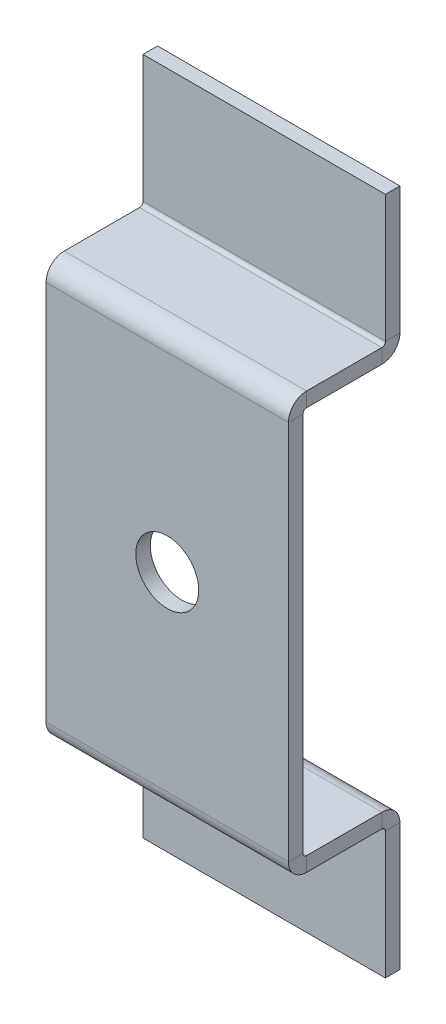
ISO-10303-21;
HEADER;
FILE_DESCRIPTION(('STEP AP214'),'2;1');
FILE_NAME('part.step','',(''),(''),'','','');
FILE_SCHEMA(('AUTOMOTIVE_DESIGN { 1 0 10303 214 1 1 1 1 }'));
ENDSEC;
DATA;
#1=APPLICATION_CONTEXT('core data for automotive mechanical design processes');
#2=APPLICATION_PROTOCOL_DEFINITION('international standard','automotive_design',2000,#1);
#3=PRODUCT_CONTEXT('',#1,'mechanical');
#4=PRODUCT('Part','Part','',(#3));
#5=PRODUCT_RELATED_PRODUCT_CATEGORY('part','',(#4));
#6=PRODUCT_DEFINITION_FORMATION('','',#4);
#7=PRODUCT_DEFINITION_CONTEXT('part definition',#1,'design');
#8=PRODUCT_DEFINITION('design','',#6,#7);
#9=PRODUCT_DEFINITION_SHAPE('','',#8);
#10=(LENGTH_UNIT() NAMED_UNIT(*) SI_UNIT(.MILLI.,.METRE.));
#11=(NAMED_UNIT(*) PLANE_ANGLE_UNIT() SI_UNIT($,.RADIAN.));
#12=(NAMED_UNIT(*) SI_UNIT($,.STERADIAN.) SOLID_ANGLE_UNIT());
#13=UNCERTAINTY_MEASURE_WITH_UNIT(LENGTH_MEASURE(1.E-05),#10,'distance_accuracy_value','');
#14=(GEOMETRIC_REPRESENTATION_CONTEXT(3) GLOBAL_UNCERTAINTY_ASSIGNED_CONTEXT((#13)) GLOBAL_UNIT_ASSIGNED_CONTEXT((#10,
#11,#12)) REPRESENTATION_CONTEXT('',''));
#15=CARTESIAN_POINT('',(0.,0.,0.));
#16=DIRECTION('',(0.,0.,1.));
#17=DIRECTION('',(1.,0.,0.));
#18=AXIS2_PLACEMENT_3D('',#15,#16,#17);
#19=CARTESIAN_POINT('',(0.,83.0000000000001,-20.));
#20=DIRECTION('',(-1.,0.,0.));
#21=DIRECTION('',(0.,0.,1.));
#22=AXIS2_PLACEMENT_3D('',#19,#20,#21);
#23=PLANE('',#22);
#24=DIRECTION('',(0.,0.,-1.));
#25=VECTOR('',#24,1.);
#26=CARTESIAN_POINT('',(0.,83.0000000000001,-20.));
#27=LINE('',#26,#25);
#28=CARTESIAN_POINT('',(0.,83.,-3.7366));
#29=VERTEX_POINT('',#28);
#30=CARTESIAN_POINT('',(0.,83.0000000000001,-19.2634));
#31=VERTEX_POINT('',#30);
#32=EDGE_CURVE('E351',#29,#31,#27,.T.);
#33=ORIENTED_EDGE('',*,*,#32,.T.);
#34=DIRECTION('',(0.,-1.,0.));
#35=VECTOR('',#34,1.);
#36=CARTESIAN_POINT('',(0.,83.0000000000001,-19.2634));
#37=LINE('',#36,#35);
#38=CARTESIAN_POINT('',(0.,80.0000000000001,-19.2634));
#39=VERTEX_POINT('',#38);
#40=EDGE_CURVE('E233',#31,#39,#37,.T.);
#41=ORIENTED_EDGE('',*,*,#40,.T.);
#42=DIRECTION('',(0.,0.,-1.));
#43=VECTOR('',#42,1.);
#44=CARTESIAN_POINT('',(0.,80.0000000000001,-20.));
#45=LINE('',#44,#43);
#46=CARTESIAN_POINT('',(0.,80.,-3.73660000000001));
#47=VERTEX_POINT('',#46);
#48=EDGE_CURVE('E350',#47,#39,#45,.T.);
#49=ORIENTED_EDGE('',*,*,#48,.F.);
#50=DIRECTION('',(0.,1.,0.));
#51=VECTOR('',#50,1.);
#52=CARTESIAN_POINT('',(0.,80.,-3.73660000000001));
#53=LINE('',#52,#51);
#54=EDGE_CURVE('E336',#47,#29,#53,.T.);
#55=ORIENTED_EDGE('',*,*,#54,.T.);
#56=EDGE_LOOP('',(#33,#41,#49,#55));
#57=FACE_BOUND('',#56,.T.);
#58=ADVANCED_FACE('F39',(#57),#23,.T.);
#59=CARTESIAN_POINT('',(0.,83.,2.71703390987154E-13));
#60=DIRECTION('',(0.,1.,0.));
#61=DIRECTION('',(0.,0.,1.));
#62=AXIS2_PLACEMENT_3D('',#59,#60,#61);
#63=PLANE('',#62);
#64=DIRECTION('',(0.,0.,1.));
#65=VECTOR('',#64,1.);
#66=CARTESIAN_POINT('',(50.,83.,-2.99999999999999));
#67=LINE('',#66,#65);
#68=CARTESIAN_POINT('',(50.,83.0000000000001,-19.2634));
#69=VERTEX_POINT('',#68);
#70=CARTESIAN_POINT('',(50.,83.,-3.7366));
#71=VERTEX_POINT('',#70);
#72=EDGE_CURVE('E353',#69,#71,#67,.T.);
#73=ORIENTED_EDGE('',*,*,#72,.F.);
#74=DIRECTION('',(-1.,0.,0.));
#75=VECTOR('',#74,1.);
#76=CARTESIAN_POINT('',(0.,83.0000000000001,-19.2634));
#77=LINE('',#76,#75);
#78=EDGE_CURVE('E63',#31,#69,#77,.F.);
#79=ORIENTED_EDGE('',*,*,#78,.F.);
#80=ORIENTED_EDGE('',*,*,#32,.F.);
#81=DIRECTION('',(1.,0.,0.));
#82=VECTOR('',#81,1.);
#83=CARTESIAN_POINT('',(0.,83.,-3.7366));
#84=LINE('',#83,#82);
#85=EDGE_CURVE('E345',#29,#71,#84,.T.);
#86=ORIENTED_EDGE('',*,*,#85,.T.);
#87=EDGE_LOOP('',(#73,#79,#80,#86));
#88=FACE_BOUND('',#87,.T.);
#89=ADVANCED_FACE('F400',(#88),#63,.T.);
#90=CARTESIAN_POINT('',(0.,80.,2.61228946970625E-13));
#91=DIRECTION('',(0.,1.,0.));
#92=DIRECTION('',(0.,0.,1.));
#93=AXIS2_PLACEMENT_3D('',#90,#91,#92);
#94=PLANE('',#93);
#95=DIRECTION('',(-1.,0.,0.));
#96=VECTOR('',#95,1.);
#97=CARTESIAN_POINT('',(0.,80.0000000000001,-19.2634));
#98=LINE('',#97,#96);
#99=CARTESIAN_POINT('',(50.,80.0000000000001,-19.2634));
#100=VERTEX_POINT('',#99);
#101=EDGE_CURVE('E186',#39,#100,#98,.F.);
#102=ORIENTED_EDGE('',*,*,#101,.T.);
#103=DIRECTION('',(0.,0.,1.));
#104=VECTOR('',#103,1.);
#105=CARTESIAN_POINT('',(50.,80.,-3.));
#106=LINE('',#105,#104);
#107=CARTESIAN_POINT('',(50.,80.,-3.73660000000001));
#108=VERTEX_POINT('',#107);
#109=EDGE_CURVE('E354',#100,#108,#106,.T.);
#110=ORIENTED_EDGE('',*,*,#109,.T.);
#111=DIRECTION('',(1.,0.,0.));
#112=VECTOR('',#111,1.);
#113=CARTESIAN_POINT('',(0.,80.,-3.73660000000001));
#114=LINE('',#113,#112);
#115=EDGE_CURVE('E339',#47,#108,#114,.T.);
#116=ORIENTED_EDGE('',*,*,#115,.F.);
#117=ORIENTED_EDGE('',*,*,#48,.T.);
#118=EDGE_LOOP('',(#102,#110,#116,#117));
#119=FACE_BOUND('',#118,.T.);
#120=ADVANCED_FACE('F408',(#119),#94,.F.);
#121=CARTESIAN_POINT('',(50.,-3.,-2.99999999999999));
#122=DIRECTION('',(1.,0.,0.));
#123=DIRECTION('',(0.,0.,-1.));
#124=AXIS2_PLACEMENT_3D('',#121,#122,#123);
#125=PLANE('',#124);
#126=DIRECTION('',(0.,0.,-1.));
#127=VECTOR('',#126,1.);
#128=CARTESIAN_POINT('',(50.,-3.,-2.99999999999999));
#129=LINE('',#128,#127);
#130=CARTESIAN_POINT('',(50.,-3.,-3.73659999999999));
#131=VERTEX_POINT('',#130);
#132=CARTESIAN_POINT('',(50.,-3.00000000000006,-19.2634));
#133=VERTEX_POINT('',#132);
#134=EDGE_CURVE('E306',#131,#133,#129,.T.);
#135=ORIENTED_EDGE('',*,*,#134,.T.);
#136=DIRECTION('',(0.,1.,0.));
#137=VECTOR('',#136,1.);
#138=CARTESIAN_POINT('',(50.,-3.00000000000006,-19.2634));
#139=LINE('',#138,#137);
#140=CARTESIAN_POINT('',(50.,0.,-19.2634));
#141=VERTEX_POINT('',#140);
#142=EDGE_CURVE('E279',#133,#141,#139,.T.);
#143=ORIENTED_EDGE('',*,*,#142,.T.);
#144=DIRECTION('',(0.,0.,-1.));
#145=VECTOR('',#144,1.);
#146=CARTESIAN_POINT('',(50.,0.,-3.));
#147=LINE('',#146,#145);
#148=CARTESIAN_POINT('',(50.,0.,-3.7366));
#149=VERTEX_POINT('',#148);
#150=EDGE_CURVE('E305',#149,#141,#147,.T.);
#151=ORIENTED_EDGE('',*,*,#150,.F.);
#152=DIRECTION('',(0.,-1.,0.));
#153=VECTOR('',#152,1.);
#154=CARTESIAN_POINT('',(50.,0.,-3.7366));
#155=LINE('',#154,#153);
#156=EDGE_CURVE('E292',#149,#131,#155,.T.);
#157=ORIENTED_EDGE('',*,*,#156,.T.);
#158=EDGE_LOOP('',(#135,#143,#151,#157));
#159=FACE_BOUND('',#158,.T.);
#160=ADVANCED_FACE('F432',(#159),#125,.T.);
#161=CARTESIAN_POINT('',(0.,-2.99999999999999,0.));
#162=DIRECTION('',(0.,1.,0.));
#163=DIRECTION('',(0.,0.,1.));
#164=AXIS2_PLACEMENT_3D('',#161,#162,#163);
#165=PLANE('',#164);
#166=DIRECTION('',(1.,0.,0.));
#167=VECTOR('',#166,1.);
#168=CARTESIAN_POINT('',(50.,-3.00000000000006,-19.2634));
#169=LINE('',#168,#167);
#170=CARTESIAN_POINT('',(0.,-3.00000000000006,-19.2634));
#171=VERTEX_POINT('',#170);
#172=EDGE_CURVE('E285',#133,#171,#169,.F.);
#173=ORIENTED_EDGE('',*,*,#172,.F.);
#174=ORIENTED_EDGE('',*,*,#134,.F.);
#175=DIRECTION('',(1.,0.,0.));
#176=VECTOR('',#175,1.);
#177=CARTESIAN_POINT('',(0.,-3.,-3.73659999999999));
#178=LINE('',#177,#176);
#179=CARTESIAN_POINT('',(0.,-3.,-3.73659999999999));
#180=VERTEX_POINT('',#179);
#181=EDGE_CURVE('E301',#180,#131,#178,.T.);
#182=ORIENTED_EDGE('',*,*,#181,.F.);
#183=DIRECTION('',(0.,0.,1.));
#184=VECTOR('',#183,1.);
#185=CARTESIAN_POINT('',(0.,-3.00000000000006,-20.));
#186=LINE('',#185,#184);
#187=EDGE_CURVE('E309',#171,#180,#186,.T.);
#188=ORIENTED_EDGE('',*,*,#187,.F.);
#189=EDGE_LOOP('',(#173,#174,#182,#188));
#190=FACE_BOUND('',#189,.T.);
#191=ADVANCED_FACE('F445',(#190),#165,.F.);
#192=CARTESIAN_POINT('',(0.,0.,0.));
#193=DIRECTION('',(0.,1.,0.));
#194=DIRECTION('',(0.,0.,1.));
#195=AXIS2_PLACEMENT_3D('',#192,#193,#194);
#196=PLANE('',#195);
#197=ORIENTED_EDGE('',*,*,#150,.T.);
#198=DIRECTION('',(1.,0.,0.));
#199=VECTOR('',#198,1.);
#200=CARTESIAN_POINT('',(50.,0.,-19.2634));
#201=LINE('',#200,#199);
#202=CARTESIAN_POINT('',(0.,0.,-19.2634));
#203=VERTEX_POINT('',#202);
#204=EDGE_CURVE('E272',#141,#203,#201,.F.);
#205=ORIENTED_EDGE('',*,*,#204,.T.);
#206=DIRECTION('',(0.,0.,1.));
#207=VECTOR('',#206,1.);
#208=CARTESIAN_POINT('',(0.,0.,-20.));
#209=LINE('',#208,#207);
#210=CARTESIAN_POINT('',(0.,0.,-3.7366));
#211=VERTEX_POINT('',#210);
#212=EDGE_CURVE('E310',#203,#211,#209,.T.);
#213=ORIENTED_EDGE('',*,*,#212,.T.);
#214=DIRECTION('',(-1.,0.,0.));
#215=VECTOR('',#214,1.);
#216=CARTESIAN_POINT('',(50.,0.,-3.7366));
#217=LINE('',#216,#215);
#218=EDGE_CURVE('E295',#149,#211,#217,.T.);
#219=ORIENTED_EDGE('',*,*,#218,.F.);
#220=EDGE_LOOP('',(#197,#205,#213,#219));
#221=FACE_BOUND('',#220,.T.);
#222=ADVANCED_FACE('F429',(#221),#196,.T.);
#223=CARTESIAN_POINT('',(0.,0.,-3.));
#224=DIRECTION('',(0.,0.,-1.));
#225=DIRECTION('',(-1.,0.,0.));
#226=AXIS2_PLACEMENT_3D('',#223,#224,#225);
#227=PLANE('',#226);
#228=CARTESIAN_POINT('',(25.,39.9999999999999,-3.));
#229=DIRECTION('',(0.,0.,-1.));
#230=DIRECTION('',(-1.,0.,0.));
#231=AXIS2_PLACEMENT_3D('',#228,#229,#230);
#232=CIRCLE('',#231,6.5);
#233=CARTESIAN_POINT('',(18.5,39.9999999999999,-3.));
#234=VERTEX_POINT('',#233);
#235=EDGE_CURVE('E489',#234,#234,#232,.T.);
#236=ORIENTED_EDGE('',*,*,#235,.F.);
#237=EDGE_LOOP('',(#236));
#238=FACE_BOUND('',#237,.T.);
#239=DIRECTION('',(0.,1.,0.));
#240=VECTOR('',#239,1.);
#241=CARTESIAN_POINT('',(50.,0.,-3.));
#242=LINE('',#241,#240);
#243=CARTESIAN_POINT('',(50.,0.736600000000001,-3.));
#244=VERTEX_POINT('',#243);
#245=CARTESIAN_POINT('',(50.,79.2634,-3.));
#246=VERTEX_POINT('',#245);
#247=EDGE_CURVE('E11',#244,#246,#242,.T.);
#248=ORIENTED_EDGE('',*,*,#247,.F.);
#249=DIRECTION('',(-1.,0.,0.));
#250=VECTOR('',#249,1.);
#251=CARTESIAN_POINT('',(0.,0.736599999999997,-3.));
#252=LINE('',#251,#250);
#253=CARTESIAN_POINT('',(0.,0.736599999999997,-3.));
#254=VERTEX_POINT('',#253);
#255=EDGE_CURVE('E328',#254,#244,#252,.F.);
#256=ORIENTED_EDGE('',*,*,#255,.F.);
#257=DIRECTION('',(0.,-1.,0.));
#258=VECTOR('',#257,1.);
#259=CARTESIAN_POINT('',(0.,0.,-3.));
#260=LINE('',#259,#258);
#261=CARTESIAN_POINT('',(0.,79.2634,-3.));
#262=VERTEX_POINT('',#261);
#263=EDGE_CURVE('E48',#262,#254,#260,.T.);
#264=ORIENTED_EDGE('',*,*,#263,.F.);
#265=DIRECTION('',(1.,0.,0.));
#266=VECTOR('',#265,1.);
#267=CARTESIAN_POINT('',(50.,79.2634,-3.));
#268=LINE('',#267,#266);
#269=EDGE_CURVE('E372',#246,#262,#268,.F.);
#270=ORIENTED_EDGE('',*,*,#269,.F.);
#271=EDGE_LOOP('',(#248,#256,#264,#270));
#272=FACE_BOUND('',#271,.T.);
#273=ADVANCED_FACE('F415',(#238,#272),#227,.T.);
#274=CARTESIAN_POINT('',(0.,0.,0.));
#275=DIRECTION('',(0.,0.,-1.));
#276=DIRECTION('',(-1.,0.,0.));
#277=AXIS2_PLACEMENT_3D('',#274,#275,#276);
#278=PLANE('',#277);
#279=CARTESIAN_POINT('',(25.,39.9999999999999,0.));
#280=DIRECTION('',(0.,0.,1.));
#281=DIRECTION('',(1.,0.,0.));
#282=AXIS2_PLACEMENT_3D('',#279,#280,#281);
#283=CIRCLE('',#282,6.5);
#284=CARTESIAN_POINT('',(31.5,39.9999999999999,0.));
#285=VERTEX_POINT('',#284);
#286=EDGE_CURVE('E487',#285,#285,#283,.T.);
#287=ORIENTED_EDGE('',*,*,#286,.F.);
#288=EDGE_LOOP('',(#287));
#289=FACE_BOUND('',#288,.T.);
#290=DIRECTION('',(-1.,0.,0.));
#291=VECTOR('',#290,1.);
#292=CARTESIAN_POINT('',(0.,0.736600000000005,0.));
#293=LINE('',#292,#291);
#294=CARTESIAN_POINT('',(0.,0.736600000000005,0.));
#295=VERTEX_POINT('',#294);
#296=CARTESIAN_POINT('',(50.,0.736600000000001,0.));
#297=VERTEX_POINT('',#296);
#298=EDGE_CURVE('E316',#295,#297,#293,.F.);
#299=ORIENTED_EDGE('',*,*,#298,.T.);
#300=DIRECTION('',(0.,1.,0.));
#301=VECTOR('',#300,1.);
#302=CARTESIAN_POINT('',(50.,0.,0.));
#303=LINE('',#302,#301);
#304=CARTESIAN_POINT('',(50.,79.2634,0.));
#305=VERTEX_POINT('',#304);
#306=EDGE_CURVE('E43',#297,#305,#303,.T.);
#307=ORIENTED_EDGE('',*,*,#306,.T.);
#308=DIRECTION('',(1.,0.,0.));
#309=VECTOR('',#308,1.);
#310=CARTESIAN_POINT('',(50.,79.2634,0.));
#311=LINE('',#310,#309);
#312=CARTESIAN_POINT('',(0.,79.2634,0.));
#313=VERTEX_POINT('',#312);
#314=EDGE_CURVE('E360',#305,#313,#311,.F.);
#315=ORIENTED_EDGE('',*,*,#314,.T.);
#316=DIRECTION('',(0.,-1.,0.));
#317=VECTOR('',#316,1.);
#318=CARTESIAN_POINT('',(0.,0.,0.));
#319=LINE('',#318,#317);
#320=EDGE_CURVE('E380',#313,#295,#319,.T.);
#321=ORIENTED_EDGE('',*,*,#320,.T.);
#322=EDGE_LOOP('',(#299,#307,#315,#321));
#323=FACE_BOUND('',#322,.T.);
#324=ADVANCED_FACE('F388',(#289,#323),#278,.F.);
#325=CARTESIAN_POINT('',(0.,0.,-3.));
#326=DIRECTION('',(-1.,0.,0.));
#327=DIRECTION('',(0.,-1.,0.));
#328=AXIS2_PLACEMENT_3D('',#325,#326,#327);
#329=PLANE('',#328);
#330=ORIENTED_EDGE('',*,*,#263,.T.);
#331=DIRECTION('',(0.,0.,1.));
#332=VECTOR('',#331,1.);
#333=CARTESIAN_POINT('',(0.,0.736599999999997,-3.));
#334=LINE('',#333,#332);
#335=EDGE_CURVE('E322',#254,#295,#334,.T.);
#336=ORIENTED_EDGE('',*,*,#335,.T.);
#337=ORIENTED_EDGE('',*,*,#320,.F.);
#338=DIRECTION('',(0.,0.,1.));
#339=VECTOR('',#338,1.);
#340=CARTESIAN_POINT('',(0.,79.2634,-3.));
#341=LINE('',#340,#339);
#342=EDGE_CURVE('E377',#262,#313,#341,.T.);
#343=ORIENTED_EDGE('',*,*,#342,.F.);
#344=EDGE_LOOP('',(#330,#336,#337,#343));
#345=FACE_BOUND('',#344,.T.);
#346=ADVANCED_FACE('F41',(#345),#329,.T.);
#347=CARTESIAN_POINT('',(50.,0.,-3.));
#348=DIRECTION('',(1.,0.,0.));
#349=DIRECTION('',(0.,1.,0.));
#350=AXIS2_PLACEMENT_3D('',#347,#348,#349);
#351=PLANE('',#350);
#352=DIRECTION('',(0.,0.,1.));
#353=VECTOR('',#352,1.);
#354=CARTESIAN_POINT('',(50.,0.736600000000001,-3.));
#355=LINE('',#354,#353);
#356=EDGE_CURVE('E333',#244,#297,#355,.T.);
#357=ORIENTED_EDGE('',*,*,#356,.F.);
#358=ORIENTED_EDGE('',*,*,#247,.T.);
#359=DIRECTION('',(0.,0.,1.));
#360=VECTOR('',#359,1.);
#361=CARTESIAN_POINT('',(50.,79.2634,-3.));
#362=LINE('',#361,#360);
#363=EDGE_CURVE('E366',#246,#305,#362,.T.);
#364=ORIENTED_EDGE('',*,*,#363,.T.);
#365=ORIENTED_EDGE('',*,*,#306,.F.);
#366=EDGE_LOOP('',(#357,#358,#364,#365));
#367=FACE_BOUND('',#366,.T.);
#368=ADVANCED_FACE('F455',(#367),#351,.T.);
#369=CARTESIAN_POINT('',(0.,79.2634,-3.73660000000001));
#370=DIRECTION('',(-1.,0.,0.));
#371=DIRECTION('',(0.,0.,1.));
#372=AXIS2_PLACEMENT_3D('',#369,#370,#371);
#373=PLANE('',#372);
#374=ORIENTED_EDGE('',*,*,#54,.F.);
#375=CARTESIAN_POINT('',(0.,79.2634,-3.73660000000001));
#376=DIRECTION('',(1.,0.,0.));
#377=DIRECTION('',(0.,0.,-1.));
#378=AXIS2_PLACEMENT_3D('',#375,#376,#377);
#379=CIRCLE('',#378,0.736600000000004);
#380=EDGE_CURVE('E369',#262,#47,#379,.F.);
#381=ORIENTED_EDGE('',*,*,#380,.F.);
#382=ORIENTED_EDGE('',*,*,#342,.T.);
#383=CARTESIAN_POINT('',(0.,79.2634,-3.73660000000001));
#384=DIRECTION('',(1.,0.,0.));
#385=DIRECTION('',(0.,0.,-1.));
#386=AXIS2_PLACEMENT_3D('',#383,#384,#385);
#387=CIRCLE('',#386,3.7366);
#388=EDGE_CURVE('E362',#313,#29,#387,.F.);
#389=ORIENTED_EDGE('',*,*,#388,.T.);
#390=EDGE_LOOP('',(#374,#381,#382,#389));
#391=FACE_BOUND('',#390,.T.);
#392=ADVANCED_FACE('F402',(#391),#373,.T.);
#393=CARTESIAN_POINT('',(50.,79.2634,-3.73660000000001));
#394=DIRECTION('',(-1.,0.,0.));
#395=DIRECTION('',(0.,0.,1.));
#396=AXIS2_PLACEMENT_3D('',#393,#394,#395);
#397=PLANE('',#396);
#398=CARTESIAN_POINT('',(50.,79.2634,-3.73660000000001));
#399=DIRECTION('',(1.,0.,0.));
#400=DIRECTION('',(0.,0.,-1.));
#401=AXIS2_PLACEMENT_3D('',#398,#399,#400);
#402=CIRCLE('',#401,0.736600000000004);
#403=EDGE_CURVE('E356',#108,#246,#402,.T.);
#404=ORIENTED_EDGE('',*,*,#403,.F.);
#405=DIRECTION('',(0.,1.,0.));
#406=VECTOR('',#405,1.);
#407=CARTESIAN_POINT('',(50.,80.,-3.73660000000001));
#408=LINE('',#407,#406);
#409=EDGE_CURVE('E342',#108,#71,#408,.T.);
#410=ORIENTED_EDGE('',*,*,#409,.T.);
#411=CARTESIAN_POINT('',(50.,79.2634,-3.73660000000001));
#412=DIRECTION('',(1.,0.,0.));
#413=DIRECTION('',(0.,0.,-1.));
#414=AXIS2_PLACEMENT_3D('',#411,#412,#413);
#415=CIRCLE('',#414,3.7366);
#416=EDGE_CURVE('E363',#71,#305,#415,.T.);
#417=ORIENTED_EDGE('',*,*,#416,.T.);
#418=ORIENTED_EDGE('',*,*,#363,.F.);
#419=EDGE_LOOP('',(#404,#410,#417,#418));
#420=FACE_BOUND('',#419,.T.);
#421=ADVANCED_FACE('F398',(#420),#397,.F.);
#422=CARTESIAN_POINT('',(50.,79.2634,-3.73660000000001));
#423=DIRECTION('',(1.,0.,0.));
#424=DIRECTION('',(0.,1.,0.));
#425=AXIS2_PLACEMENT_3D('',#422,#423,#424);
#426=CYLINDRICAL_SURFACE('',#425,3.7366);
#427=ORIENTED_EDGE('',*,*,#314,.F.);
#428=ORIENTED_EDGE('',*,*,#416,.F.);
#429=ORIENTED_EDGE('',*,*,#85,.F.);
#430=ORIENTED_EDGE('',*,*,#388,.F.);
#431=EDGE_LOOP('',(#427,#428,#429,#430));
#432=FACE_BOUND('',#431,.T.);
#433=ADVANCED_FACE('F394',(#432),#426,.T.);
#434=CARTESIAN_POINT('',(50.,79.2634,-3.73660000000001));
#435=DIRECTION('',(1.,0.,0.));
#436=DIRECTION('',(0.,1.,0.));
#437=AXIS2_PLACEMENT_3D('',#434,#435,#436);
#438=CYLINDRICAL_SURFACE('',#437,0.736600000000004);
#439=ORIENTED_EDGE('',*,*,#269,.T.);
#440=ORIENTED_EDGE('',*,*,#380,.T.);
#441=ORIENTED_EDGE('',*,*,#115,.T.);
#442=ORIENTED_EDGE('',*,*,#403,.T.);
#443=EDGE_LOOP('',(#439,#440,#441,#442));
#444=FACE_BOUND('',#443,.T.);
#445=ADVANCED_FACE('F410',(#444),#438,.F.);
#446=CARTESIAN_POINT('',(50.,83.,-2.99999999999999));
#447=DIRECTION('',(1.,0.,0.));
#448=DIRECTION('',(0.,0.,-1.));
#449=AXIS2_PLACEMENT_3D('',#446,#447,#448);
#450=PLANE('',#449);
#451=DIRECTION('',(0.,-1.,0.));
#452=VECTOR('',#451,1.);
#453=CARTESIAN_POINT('',(50.,83.0000000000001,-19.2634));
#454=LINE('',#453,#452);
#455=EDGE_CURVE('E56',#69,#100,#454,.T.);
#456=ORIENTED_EDGE('',*,*,#455,.F.);
#457=ORIENTED_EDGE('',*,*,#72,.T.);
#458=ORIENTED_EDGE('',*,*,#409,.F.);
#459=ORIENTED_EDGE('',*,*,#109,.F.);
#460=EDGE_LOOP('',(#456,#457,#458,#459));
#461=FACE_BOUND('',#460,.T.);
#462=ADVANCED_FACE('F471',(#461),#450,.T.);
#463=CARTESIAN_POINT('',(50.,0.736599999999999,-3.7366));
#464=DIRECTION('',(1.,0.,0.));
#465=DIRECTION('',(0.,1.,0.));
#466=AXIS2_PLACEMENT_3D('',#463,#464,#465);
#467=PLANE('',#466);
#468=ORIENTED_EDGE('',*,*,#156,.F.);
#469=CARTESIAN_POINT('',(50.,0.736599999999999,-3.7366));
#470=DIRECTION('',(-1.,0.,0.));
#471=DIRECTION('',(0.,-1.,0.));
#472=AXIS2_PLACEMENT_3D('',#469,#470,#471);
#473=CIRCLE('',#472,0.736600000000002);
#474=EDGE_CURVE('E325',#244,#149,#473,.F.);
#475=ORIENTED_EDGE('',*,*,#474,.F.);
#476=ORIENTED_EDGE('',*,*,#356,.T.);
#477=CARTESIAN_POINT('',(50.,0.736599999999999,-3.7366));
#478=DIRECTION('',(-1.,0.,0.));
#479=DIRECTION('',(0.,-1.,0.));
#480=AXIS2_PLACEMENT_3D('',#477,#478,#479);
#481=CIRCLE('',#480,3.7366);
#482=EDGE_CURVE('E318',#297,#131,#481,.F.);
#483=ORIENTED_EDGE('',*,*,#482,.T.);
#484=EDGE_LOOP('',(#468,#475,#476,#483));
#485=FACE_BOUND('',#484,.T.);
#486=ADVANCED_FACE('F454',(#485),#467,.T.);
#487=CARTESIAN_POINT('',(0.,0.736599999999996,-3.7366));
#488=DIRECTION('',(1.,0.,0.));
#489=DIRECTION('',(0.,1.,0.));
#490=AXIS2_PLACEMENT_3D('',#487,#488,#489);
#491=PLANE('',#490);
#492=CARTESIAN_POINT('',(0.,0.736599999999996,-3.7366));
#493=DIRECTION('',(-1.,0.,0.));
#494=DIRECTION('',(0.,-1.,0.));
#495=AXIS2_PLACEMENT_3D('',#492,#493,#494);
#496=CIRCLE('',#495,0.736600000000002);
#497=EDGE_CURVE('E312',#211,#254,#496,.T.);
#498=ORIENTED_EDGE('',*,*,#497,.F.);
#499=DIRECTION('',(0.,-1.,0.));
#500=VECTOR('',#499,1.);
#501=CARTESIAN_POINT('',(0.,0.,-3.7366));
#502=LINE('',#501,#500);
#503=EDGE_CURVE('E298',#211,#180,#502,.T.);
#504=ORIENTED_EDGE('',*,*,#503,.T.);
#505=CARTESIAN_POINT('',(0.,0.736599999999996,-3.7366));
#506=DIRECTION('',(-1.,0.,0.));
#507=DIRECTION('',(0.,-1.,0.));
#508=AXIS2_PLACEMENT_3D('',#505,#506,#507);
#509=CIRCLE('',#508,3.7366);
#510=EDGE_CURVE('E319',#180,#295,#509,.T.);
#511=ORIENTED_EDGE('',*,*,#510,.T.);
#512=ORIENTED_EDGE('',*,*,#335,.F.);
#513=EDGE_LOOP('',(#498,#504,#511,#512));
#514=FACE_BOUND('',#513,.T.);
#515=ADVANCED_FACE('F420',(#514),#491,.F.);
#516=CARTESIAN_POINT('',(0.,0.736599999999996,-3.7366));
#517=DIRECTION('',(-1.,0.,0.));
#518=DIRECTION('',(0.,-1.,0.));
#519=AXIS2_PLACEMENT_3D('',#516,#517,#518);
#520=CYLINDRICAL_SURFACE('',#519,3.7366);
#521=ORIENTED_EDGE('',*,*,#298,.F.);
#522=ORIENTED_EDGE('',*,*,#510,.F.);
#523=ORIENTED_EDGE('',*,*,#181,.T.);
#524=ORIENTED_EDGE('',*,*,#482,.F.);
#525=EDGE_LOOP('',(#521,#522,#523,#524));
#526=FACE_BOUND('',#525,.T.);
#527=ADVANCED_FACE('F451',(#526),#520,.T.);
#528=CARTESIAN_POINT('',(0.,0.736599999999996,-3.7366));
#529=DIRECTION('',(-1.,0.,0.));
#530=DIRECTION('',(0.,-1.,0.));
#531=AXIS2_PLACEMENT_3D('',#528,#529,#530);
#532=CYLINDRICAL_SURFACE('',#531,0.736600000000002);
#533=ORIENTED_EDGE('',*,*,#255,.T.);
#534=ORIENTED_EDGE('',*,*,#474,.T.);
#535=ORIENTED_EDGE('',*,*,#218,.T.);
#536=ORIENTED_EDGE('',*,*,#497,.T.);
#537=EDGE_LOOP('',(#533,#534,#535,#536));
#538=FACE_BOUND('',#537,.T.);
#539=ADVANCED_FACE('F424',(#538),#532,.F.);
#540=CARTESIAN_POINT('',(0.,-3.00000000000006,-20.));
#541=DIRECTION('',(-1.,0.,0.));
#542=DIRECTION('',(0.,0.,1.));
#543=AXIS2_PLACEMENT_3D('',#540,#541,#542);
#544=PLANE('',#543);
#545=DIRECTION('',(0.,1.,0.));
#546=VECTOR('',#545,1.);
#547=CARTESIAN_POINT('',(0.,-3.00000000000006,-19.2634));
#548=LINE('',#547,#546);
#549=EDGE_CURVE('E289',#171,#203,#548,.T.);
#550=ORIENTED_EDGE('',*,*,#549,.F.);
#551=ORIENTED_EDGE('',*,*,#187,.T.);
#552=ORIENTED_EDGE('',*,*,#503,.F.);
#553=ORIENTED_EDGE('',*,*,#212,.F.);
#554=EDGE_LOOP('',(#550,#551,#552,#553));
#555=FACE_BOUND('',#554,.T.);
#556=ADVANCED_FACE('F449',(#555),#544,.T.);
#557=CARTESIAN_POINT('',(0.,-3.73660000000006,-19.2634));
#558=DIRECTION('',(-1.,0.,0.));
#559=DIRECTION('',(0.,0.,1.));
#560=AXIS2_PLACEMENT_3D('',#557,#558,#559);
#561=PLANE('',#560);
#562=DIRECTION('',(0.,0.,-1.));
#563=VECTOR('',#562,1.);
#564=CARTESIAN_POINT('',(0.,-3.73660000000006,-20.));
#565=LINE('',#564,#563);
#566=CARTESIAN_POINT('',(0.,-3.73660000000006,-20.));
#567=VERTEX_POINT('',#566);
#568=CARTESIAN_POINT('',(0.,-3.73660000000006,-23.));
#569=VERTEX_POINT('',#568);
#570=EDGE_CURVE('E240',#567,#569,#565,.T.);
#571=ORIENTED_EDGE('',*,*,#570,.F.);
#572=CARTESIAN_POINT('',(0.,-3.73660000000006,-19.2634));
#573=DIRECTION('',(1.,0.,0.));
#574=DIRECTION('',(0.,0.,-1.));
#575=AXIS2_PLACEMENT_3D('',#572,#573,#574);
#576=CIRCLE('',#575,0.7366);
#577=EDGE_CURVE('E282',#171,#567,#576,.F.);
#578=ORIENTED_EDGE('',*,*,#577,.F.);
#579=ORIENTED_EDGE('',*,*,#549,.T.);
#580=CARTESIAN_POINT('',(0.,-3.73660000000006,-19.2634));
#581=DIRECTION('',(1.,0.,0.));
#582=DIRECTION('',(0.,0.,-1.));
#583=AXIS2_PLACEMENT_3D('',#580,#581,#582);
#584=CIRCLE('',#583,3.7366);
#585=EDGE_CURVE('E275',#203,#569,#584,.F.);
#586=ORIENTED_EDGE('',*,*,#585,.T.);
#587=EDGE_LOOP('',(#571,#578,#579,#586));
#588=FACE_BOUND('',#587,.T.);
#589=ADVANCED_FACE('F559',(#588),#561,.T.);
#590=CARTESIAN_POINT('',(50.,-3.73660000000006,-19.2634));
#591=DIRECTION('',(-1.,0.,0.));
#592=DIRECTION('',(0.,0.,1.));
#593=AXIS2_PLACEMENT_3D('',#590,#591,#592);
#594=PLANE('',#593);
#595=CARTESIAN_POINT('',(50.,-3.73660000000006,-19.2634));
#596=DIRECTION('',(1.,0.,0.));
#597=DIRECTION('',(0.,0.,-1.));
#598=AXIS2_PLACEMENT_3D('',#595,#596,#597);
#599=CIRCLE('',#598,0.7366);
#600=CARTESIAN_POINT('',(50.,-3.73660000000006,-20.));
#601=VERTEX_POINT('',#600);
#602=EDGE_CURVE('E271',#601,#133,#599,.T.);
#603=ORIENTED_EDGE('',*,*,#602,.F.);
#604=DIRECTION('',(0.,0.,-1.));
#605=VECTOR('',#604,1.);
#606=CARTESIAN_POINT('',(50.,-3.73660000000006,-20.));
#607=LINE('',#606,#605);
#608=CARTESIAN_POINT('',(50.,-3.73660000000003,-23.));
#609=VERTEX_POINT('',#608);
#610=EDGE_CURVE('E244',#601,#609,#607,.T.);
#611=ORIENTED_EDGE('',*,*,#610,.T.);
#612=CARTESIAN_POINT('',(50.,-3.73660000000006,-19.2634));
#613=DIRECTION('',(1.,0.,0.));
#614=DIRECTION('',(0.,0.,-1.));
#615=AXIS2_PLACEMENT_3D('',#612,#613,#614);
#616=CIRCLE('',#615,3.7366);
#617=EDGE_CURVE('E276',#609,#141,#616,.T.);
#618=ORIENTED_EDGE('',*,*,#617,.T.);
#619=ORIENTED_EDGE('',*,*,#142,.F.);
#620=EDGE_LOOP('',(#603,#611,#618,#619));
#621=FACE_BOUND('',#620,.T.);
#622=ADVANCED_FACE('F436',(#621),#594,.F.);
#623=CARTESIAN_POINT('',(50.,-3.73660000000006,-19.2634));
#624=DIRECTION('',(1.,0.,0.));
#625=DIRECTION('',(0.,0.,-1.));
#626=AXIS2_PLACEMENT_3D('',#623,#624,#625);
#627=CYLINDRICAL_SURFACE('',#626,3.7366);
#628=ORIENTED_EDGE('',*,*,#204,.F.);
#629=ORIENTED_EDGE('',*,*,#617,.F.);
#630=DIRECTION('',(-1.,0.,0.));
#631=VECTOR('',#630,1.);
#632=CARTESIAN_POINT('',(0.,-3.73660000000003,-23.));
#633=LINE('',#632,#631);
#634=EDGE_CURVE('E247',#609,#569,#633,.T.);
#635=ORIENTED_EDGE('',*,*,#634,.T.);
#636=ORIENTED_EDGE('',*,*,#585,.F.);
#637=EDGE_LOOP('',(#628,#629,#635,#636));
#638=FACE_BOUND('',#637,.T.);
#639=ADVANCED_FACE('F553',(#638),#627,.T.);
#640=CARTESIAN_POINT('',(50.,-3.73660000000006,-19.2634));
#641=DIRECTION('',(1.,0.,0.));
#642=DIRECTION('',(0.,0.,-1.));
#643=AXIS2_PLACEMENT_3D('',#640,#641,#642);
#644=CYLINDRICAL_SURFACE('',#643,0.7366);
#645=ORIENTED_EDGE('',*,*,#172,.T.);
#646=ORIENTED_EDGE('',*,*,#577,.T.);
#647=DIRECTION('',(1.,0.,0.));
#648=VECTOR('',#647,1.);
#649=CARTESIAN_POINT('',(0.,-3.73660000000006,-20.));
#650=LINE('',#649,#648);
#651=EDGE_CURVE('E242',#567,#601,#650,.T.);
#652=ORIENTED_EDGE('',*,*,#651,.T.);
#653=ORIENTED_EDGE('',*,*,#602,.T.);
#654=EDGE_LOOP('',(#645,#646,#652,#653));
#655=FACE_BOUND('',#654,.T.);
#656=ADVANCED_FACE('F440',(#655),#644,.F.);
#657=CARTESIAN_POINT('',(50.,-30.0000000000001,-23.));
#658=DIRECTION('',(-1.,0.,0.));
#659=DIRECTION('',(0.,0.,1.));
#660=AXIS2_PLACEMENT_3D('',#657,#658,#659);
#661=PLANE('',#660);
#662=ORIENTED_EDGE('',*,*,#610,.F.);
#663=DIRECTION('',(0.,-1.,0.));
#664=VECTOR('',#663,1.);
#665=CARTESIAN_POINT('',(50.,-30.0000000000001,-20.));
#666=LINE('',#665,#664);
#667=CARTESIAN_POINT('',(50.,-30.0000000000001,-20.));
#668=VERTEX_POINT('',#667);
#669=EDGE_CURVE('E251',#601,#668,#666,.T.);
#670=ORIENTED_EDGE('',*,*,#669,.T.);
#671=DIRECTION('',(0.,0.,1.));
#672=VECTOR('',#671,1.);
#673=CARTESIAN_POINT('',(50.,-30.0000000000001,-23.));
#674=LINE('',#673,#672);
#675=CARTESIAN_POINT('',(50.,-30.0000000000001,-23.));
#676=VERTEX_POINT('',#675);
#677=EDGE_CURVE('E268',#676,#668,#674,.T.);
#678=ORIENTED_EDGE('',*,*,#677,.F.);
#679=DIRECTION('',(0.,-1.,0.));
#680=VECTOR('',#679,1.);
#681=CARTESIAN_POINT('',(50.,-30.0000000000001,-23.));
#682=LINE('',#681,#680);
#683=EDGE_CURVE('E252',#609,#676,#682,.T.);
#684=ORIENTED_EDGE('',*,*,#683,.F.);
#685=EDGE_LOOP('',(#662,#670,#678,#684));
#686=FACE_BOUND('',#685,.T.);
#687=ADVANCED_FACE('F545',(#686),#661,.F.);
#688=CARTESIAN_POINT('',(0.,-3.00000000000006,-23.));
#689=DIRECTION('',(1.,0.,0.));
#690=DIRECTION('',(0.,0.,-1.));
#691=AXIS2_PLACEMENT_3D('',#688,#689,#690);
#692=PLANE('',#691);
#693=ORIENTED_EDGE('',*,*,#570,.T.);
#694=DIRECTION('',(0.,1.,0.));
#695=VECTOR('',#694,1.);
#696=CARTESIAN_POINT('',(0.,-3.00000000000006,-23.));
#697=LINE('',#696,#695);
#698=CARTESIAN_POINT('',(0.,-30.0000000000001,-23.));
#699=VERTEX_POINT('',#698);
#700=EDGE_CURVE('E257',#699,#569,#697,.T.);
#701=ORIENTED_EDGE('',*,*,#700,.F.);
#702=DIRECTION('',(0.,0.,1.));
#703=VECTOR('',#702,1.);
#704=CARTESIAN_POINT('',(0.,-30.0000000000001,-23.));
#705=LINE('',#704,#703);
#706=CARTESIAN_POINT('',(0.,-30.0000000000001,-20.));
#707=VERTEX_POINT('',#706);
#708=EDGE_CURVE('E260',#699,#707,#705,.T.);
#709=ORIENTED_EDGE('',*,*,#708,.T.);
#710=DIRECTION('',(0.,1.,0.));
#711=VECTOR('',#710,1.);
#712=CARTESIAN_POINT('',(0.,-3.00000000000006,-20.));
#713=LINE('',#712,#711);
#714=EDGE_CURVE('E255',#707,#567,#713,.T.);
#715=ORIENTED_EDGE('',*,*,#714,.T.);
#716=EDGE_LOOP('',(#693,#701,#709,#715));
#717=FACE_BOUND('',#716,.T.);
#718=ADVANCED_FACE('F538',(#717),#692,.F.);
#719=CARTESIAN_POINT('',(0.,0.,-23.));
#720=DIRECTION('',(0.,0.,1.));
#721=DIRECTION('',(1.,0.,0.));
#722=AXIS2_PLACEMENT_3D('',#719,#720,#721);
#723=PLANE('',#722);
#724=ORIENTED_EDGE('',*,*,#634,.F.);
#725=ORIENTED_EDGE('',*,*,#683,.T.);
#726=DIRECTION('',(-1.,0.,0.));
#727=VECTOR('',#726,1.);
#728=CARTESIAN_POINT('',(0.,-30.0000000000001,-23.));
#729=LINE('',#728,#727);
#730=EDGE_CURVE('E254',#676,#699,#729,.T.);
#731=ORIENTED_EDGE('',*,*,#730,.T.);
#732=ORIENTED_EDGE('',*,*,#700,.T.);
#733=EDGE_LOOP('',(#724,#725,#731,#732));
#734=FACE_BOUND('',#733,.T.);
#735=ADVANCED_FACE('F534',(#734),#723,.F.);
#736=CARTESIAN_POINT('',(0.,0.,-20.));
#737=DIRECTION('',(0.,0.,1.));
#738=DIRECTION('',(1.,0.,0.));
#739=AXIS2_PLACEMENT_3D('',#736,#737,#738);
#740=PLANE('',#739);
#741=ORIENTED_EDGE('',*,*,#669,.F.);
#742=ORIENTED_EDGE('',*,*,#651,.F.);
#743=ORIENTED_EDGE('',*,*,#714,.F.);
#744=DIRECTION('',(-1.,0.,0.));
#745=VECTOR('',#744,1.);
#746=CARTESIAN_POINT('',(0.,-30.0000000000001,-20.));
#747=LINE('',#746,#745);
#748=EDGE_CURVE('E262',#668,#707,#747,.T.);
#749=ORIENTED_EDGE('',*,*,#748,.F.);
#750=EDGE_LOOP('',(#741,#742,#743,#749));
#751=FACE_BOUND('',#750,.T.);
#752=ADVANCED_FACE('F537',(#751),#740,.T.);
#753=CARTESIAN_POINT('',(0.,-30.0000000000001,-23.));
#754=DIRECTION('',(0.,1.,0.));
#755=DIRECTION('',(0.,0.,1.));
#756=AXIS2_PLACEMENT_3D('',#753,#754,#755);
#757=PLANE('',#756);
#758=ORIENTED_EDGE('',*,*,#748,.T.);
#759=ORIENTED_EDGE('',*,*,#708,.F.);
#760=ORIENTED_EDGE('',*,*,#730,.F.);
#761=ORIENTED_EDGE('',*,*,#677,.T.);
#762=EDGE_LOOP('',(#758,#759,#760,#761));
#763=FACE_BOUND('',#762,.T.);
#764=ADVANCED_FACE('F531',(#763),#757,.F.);
#765=CARTESIAN_POINT('',(50.,83.7366000000001,-19.2634));
#766=DIRECTION('',(1.,0.,0.));
#767=DIRECTION('',(0.,0.,-1.));
#768=AXIS2_PLACEMENT_3D('',#765,#766,#767);
#769=PLANE('',#768);
#770=DIRECTION('',(0.,0.,-1.));
#771=VECTOR('',#770,1.);
#772=CARTESIAN_POINT('',(50.,83.7366000000001,-20.));
#773=LINE('',#772,#771);
#774=CARTESIAN_POINT('',(50.,83.7366000000001,-20.));
#775=VERTEX_POINT('',#774);
#776=CARTESIAN_POINT('',(50.,83.7366000000001,-23.));
#777=VERTEX_POINT('',#776);
#778=EDGE_CURVE('E492',#775,#777,#773,.T.);
#779=ORIENTED_EDGE('',*,*,#778,.F.);
#780=CARTESIAN_POINT('',(50.,83.7366000000001,-19.2634));
#781=DIRECTION('',(-1.,0.,0.));
#782=DIRECTION('',(0.,0.,1.));
#783=AXIS2_PLACEMENT_3D('',#780,#781,#782);
#784=CIRCLE('',#783,0.7366);
#785=EDGE_CURVE('E189',#69,#775,#784,.F.);
#786=ORIENTED_EDGE('',*,*,#785,.F.);
#787=ORIENTED_EDGE('',*,*,#455,.T.);
#788=CARTESIAN_POINT('',(50.,83.7366000000001,-19.2634));
#789=DIRECTION('',(-1.,0.,0.));
#790=DIRECTION('',(0.,0.,1.));
#791=AXIS2_PLACEMENT_3D('',#788,#789,#790);
#792=CIRCLE('',#791,3.7366);
#793=EDGE_CURVE('E232',#100,#777,#792,.F.);
#794=ORIENTED_EDGE('',*,*,#793,.T.);
#795=EDGE_LOOP('',(#779,#786,#787,#794));
#796=FACE_BOUND('',#795,.T.);
#797=ADVANCED_FACE('F501',(#796),#769,.T.);
#798=CARTESIAN_POINT('',(0.,83.7366000000001,-19.2634));
#799=DIRECTION('',(1.,0.,0.));
#800=DIRECTION('',(0.,0.,-1.));
#801=AXIS2_PLACEMENT_3D('',#798,#799,#800);
#802=PLANE('',#801);
#803=CARTESIAN_POINT('',(0.,83.7366000000001,-19.2634));
#804=DIRECTION('',(-1.,0.,0.));
#805=DIRECTION('',(0.,0.,1.));
#806=AXIS2_PLACEMENT_3D('',#803,#804,#805);
#807=CIRCLE('',#806,0.7366);
#808=CARTESIAN_POINT('',(0.,83.7366000000001,-20.));
#809=VERTEX_POINT('',#808);
#810=EDGE_CURVE('E196',#809,#31,#807,.T.);
#811=ORIENTED_EDGE('',*,*,#810,.F.);
#812=DIRECTION('',(0.,0.,-1.));
#813=VECTOR('',#812,1.);
#814=CARTESIAN_POINT('',(0.,83.7366000000001,-20.));
#815=LINE('',#814,#813);
#816=CARTESIAN_POINT('',(0.,83.7366000000001,-23.));
#817=VERTEX_POINT('',#816);
#818=EDGE_CURVE('E193',#809,#817,#815,.T.);
#819=ORIENTED_EDGE('',*,*,#818,.T.);
#820=CARTESIAN_POINT('',(0.,83.7366000000001,-19.2634));
#821=DIRECTION('',(-1.,0.,0.));
#822=DIRECTION('',(0.,0.,1.));
#823=AXIS2_PLACEMENT_3D('',#820,#821,#822);
#824=CIRCLE('',#823,3.7366);
#825=EDGE_CURVE('E179',#817,#39,#824,.T.);
#826=ORIENTED_EDGE('',*,*,#825,.T.);
#827=ORIENTED_EDGE('',*,*,#40,.F.);
#828=EDGE_LOOP('',(#811,#819,#826,#827));
#829=FACE_BOUND('',#828,.T.);
#830=ADVANCED_FACE('F194',(#829),#802,.F.);
#831=CARTESIAN_POINT('',(0.,83.7366000000001,-19.2634));
#832=DIRECTION('',(-1.,0.,0.));
#833=DIRECTION('',(0.,0.,-1.));
#834=AXIS2_PLACEMENT_3D('',#831,#832,#833);
#835=CYLINDRICAL_SURFACE('',#834,3.7366);
#836=ORIENTED_EDGE('',*,*,#101,.F.);
#837=ORIENTED_EDGE('',*,*,#825,.F.);
#838=DIRECTION('',(1.,0.,0.));
#839=VECTOR('',#838,1.);
#840=CARTESIAN_POINT('',(0.,83.7366000000001,-23.));
#841=LINE('',#840,#839);
#842=EDGE_CURVE('E184',#817,#777,#841,.T.);
#843=ORIENTED_EDGE('',*,*,#842,.T.);
#844=ORIENTED_EDGE('',*,*,#793,.F.);
#845=EDGE_LOOP('',(#836,#837,#843,#844));
#846=FACE_BOUND('',#845,.T.);
#847=ADVANCED_FACE('F181',(#846),#835,.T.);
#848=CARTESIAN_POINT('',(0.,83.7366000000001,-19.2634));
#849=DIRECTION('',(-1.,0.,0.));
#850=DIRECTION('',(0.,0.,-1.));
#851=AXIS2_PLACEMENT_3D('',#848,#849,#850);
#852=CYLINDRICAL_SURFACE('',#851,0.7366);
#853=ORIENTED_EDGE('',*,*,#78,.T.);
#854=ORIENTED_EDGE('',*,*,#785,.T.);
#855=DIRECTION('',(-1.,0.,0.));
#856=VECTOR('',#855,1.);
#857=CARTESIAN_POINT('',(50.,83.7366000000001,-20.));
#858=LINE('',#857,#856);
#859=EDGE_CURVE('E200',#775,#809,#858,.T.);
#860=ORIENTED_EDGE('',*,*,#859,.T.);
#861=ORIENTED_EDGE('',*,*,#810,.T.);
#862=EDGE_LOOP('',(#853,#854,#860,#861));
#863=FACE_BOUND('',#862,.T.);
#864=ADVANCED_FACE('F504',(#863),#852,.F.);
#865=CARTESIAN_POINT('',(0.,110.,-23.));
#866=DIRECTION('',(1.,0.,0.));
#867=DIRECTION('',(0.,0.,-1.));
#868=AXIS2_PLACEMENT_3D('',#865,#866,#867);
#869=PLANE('',#868);
#870=ORIENTED_EDGE('',*,*,#818,.F.);
#871=DIRECTION('',(0.,1.,0.));
#872=VECTOR('',#871,1.);
#873=CARTESIAN_POINT('',(0.,110.,-20.));
#874=LINE('',#873,#872);
#875=CARTESIAN_POINT('',(0.,110.,-20.));
#876=VERTEX_POINT('',#875);
#877=EDGE_CURVE('E209',#809,#876,#874,.T.);
#878=ORIENTED_EDGE('',*,*,#877,.T.);
#879=DIRECTION('',(0.,0.,1.));
#880=VECTOR('',#879,1.);
#881=CARTESIAN_POINT('',(0.,110.,-23.));
#882=LINE('',#881,#880);
#883=CARTESIAN_POINT('',(0.,110.,-23.));
#884=VERTEX_POINT('',#883);
#885=EDGE_CURVE('E214',#884,#876,#882,.T.);
#886=ORIENTED_EDGE('',*,*,#885,.F.);
#887=DIRECTION('',(0.,1.,0.));
#888=VECTOR('',#887,1.);
#889=CARTESIAN_POINT('',(0.,110.,-23.));
#890=LINE('',#889,#888);
#891=EDGE_CURVE('E205',#817,#884,#890,.T.);
#892=ORIENTED_EDGE('',*,*,#891,.F.);
#893=EDGE_LOOP('',(#870,#878,#886,#892));
#894=FACE_BOUND('',#893,.T.);
#895=ADVANCED_FACE('F212',(#894),#869,.F.);
#896=CARTESIAN_POINT('',(50.,83.0000000000001,-23.));
#897=DIRECTION('',(-1.,0.,0.));
#898=DIRECTION('',(0.,0.,1.));
#899=AXIS2_PLACEMENT_3D('',#896,#897,#898);
#900=PLANE('',#899);
#901=ORIENTED_EDGE('',*,*,#778,.T.);
#902=DIRECTION('',(0.,-1.,0.));
#903=VECTOR('',#902,1.);
#904=CARTESIAN_POINT('',(50.,83.0000000000001,-23.));
#905=LINE('',#904,#903);
#906=CARTESIAN_POINT('',(50.,110.,-23.));
#907=VERTEX_POINT('',#906);
#908=EDGE_CURVE('E208',#907,#777,#905,.T.);
#909=ORIENTED_EDGE('',*,*,#908,.F.);
#910=DIRECTION('',(0.,0.,1.));
#911=VECTOR('',#910,1.);
#912=CARTESIAN_POINT('',(50.,110.,-23.));
#913=LINE('',#912,#911);
#914=CARTESIAN_POINT('',(50.,110.,-20.));
#915=VERTEX_POINT('',#914);
#916=EDGE_CURVE('E225',#907,#915,#913,.T.);
#917=ORIENTED_EDGE('',*,*,#916,.T.);
#918=DIRECTION('',(0.,-1.,0.));
#919=VECTOR('',#918,1.);
#920=CARTESIAN_POINT('',(50.,83.0000000000001,-20.));
#921=LINE('',#920,#919);
#922=EDGE_CURVE('E216',#915,#775,#921,.T.);
#923=ORIENTED_EDGE('',*,*,#922,.T.);
#924=EDGE_LOOP('',(#901,#909,#917,#923));
#925=FACE_BOUND('',#924,.T.);
#926=ADVANCED_FACE('F497',(#925),#900,.F.);
#927=CARTESIAN_POINT('',(0.,0.,-23.));
#928=DIRECTION('',(0.,0.,1.));
#929=DIRECTION('',(0.,-1.,0.));
#930=AXIS2_PLACEMENT_3D('',#927,#928,#929);
#931=PLANE('',#930);
#932=ORIENTED_EDGE('',*,*,#842,.F.);
#933=ORIENTED_EDGE('',*,*,#891,.T.);
#934=DIRECTION('',(1.,0.,0.));
#935=VECTOR('',#934,1.);
#936=CARTESIAN_POINT('',(50.,110.,-23.));
#937=LINE('',#936,#935);
#938=EDGE_CURVE('E215',#884,#907,#937,.T.);
#939=ORIENTED_EDGE('',*,*,#938,.T.);
#940=ORIENTED_EDGE('',*,*,#908,.T.);
#941=EDGE_LOOP('',(#932,#933,#939,#940));
#942=FACE_BOUND('',#941,.T.);
#943=ADVANCED_FACE('F204',(#942),#931,.F.);
#944=CARTESIAN_POINT('',(0.,0.,-20.));
#945=DIRECTION('',(0.,0.,1.));
#946=DIRECTION('',(0.,-1.,0.));
#947=AXIS2_PLACEMENT_3D('',#944,#945,#946);
#948=PLANE('',#947);
#949=ORIENTED_EDGE('',*,*,#877,.F.);
#950=ORIENTED_EDGE('',*,*,#859,.F.);
#951=ORIENTED_EDGE('',*,*,#922,.F.);
#952=DIRECTION('',(1.,0.,0.));
#953=VECTOR('',#952,1.);
#954=CARTESIAN_POINT('',(50.,110.,-20.));
#955=LINE('',#954,#953);
#956=EDGE_CURVE('E220',#876,#915,#955,.T.);
#957=ORIENTED_EDGE('',*,*,#956,.F.);
#958=EDGE_LOOP('',(#949,#950,#951,#957));
#959=FACE_BOUND('',#958,.T.);
#960=ADVANCED_FACE('F506',(#959),#948,.T.);
#961=CARTESIAN_POINT('',(50.,110.,-23.));
#962=DIRECTION('',(0.,-1.,0.));
#963=DIRECTION('',(0.,0.,-1.));
#964=AXIS2_PLACEMENT_3D('',#961,#962,#963);
#965=PLANE('',#964);
#966=ORIENTED_EDGE('',*,*,#956,.T.);
#967=ORIENTED_EDGE('',*,*,#916,.F.);
#968=ORIENTED_EDGE('',*,*,#938,.F.);
#969=ORIENTED_EDGE('',*,*,#885,.T.);
#970=EDGE_LOOP('',(#966,#967,#968,#969));
#971=FACE_BOUND('',#970,.T.);
#972=ADVANCED_FACE('F510',(#971),#965,.F.);
#973=CARTESIAN_POINT('',(25.,39.9999999999999,-23.));
#974=DIRECTION('',(0.,0.,1.));
#975=DIRECTION('',(1.,0.,0.));
#976=AXIS2_PLACEMENT_3D('',#973,#974,#975);
#977=CYLINDRICAL_SURFACE('',#976,6.5);
#978=ORIENTED_EDGE('',*,*,#235,.T.);
#979=EDGE_LOOP('',(#978));
#980=FACE_BOUND('',#979,.T.);
#981=ORIENTED_EDGE('',*,*,#286,.T.);
#982=EDGE_LOOP('',(#981));
#983=FACE_BOUND('',#982,.T.);
#984=ADVANCED_FACE('F512',(#980,#983),#977,.F.);
#985=CLOSED_SHELL('',(#58,#89,#120,#160,#191,#222,#273,#324,#346,#368,#392,#421,#433,#445,#462,
#486,#515,#527,#539,#556,#589,#622,#639,#656,#687,#718,#735,#752,#764,#797,#830,#847,#864,#895,
#926,#943,#960,#972,#984));
#986=MANIFOLD_SOLID_BREP('B2',#985);
#987=ADVANCED_BREP_SHAPE_REPRESENTATION('',(#18,#986),#14);
#988=SHAPE_DEFINITION_REPRESENTATION(#9,#987);
ENDSEC;
END-ISO-10303-21;
